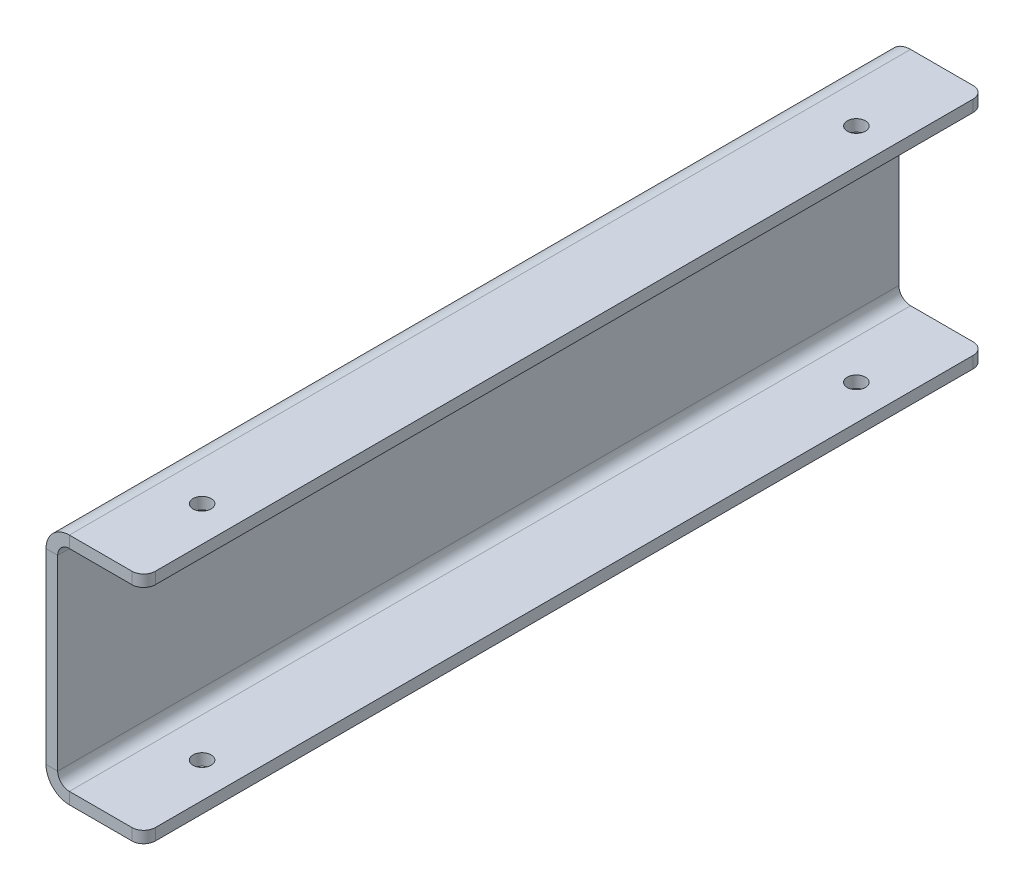
ISO-10303-21;
HEADER;
FILE_DESCRIPTION(('STEP AP214'),'2;1');
FILE_NAME('part.step','',(''),(''),'','','');
FILE_SCHEMA(('AUTOMOTIVE_DESIGN { 1 0 10303 214 1 1 1 1 }'));
ENDSEC;
DATA;
#1=APPLICATION_CONTEXT('core data for automotive mechanical design processes');
#2=APPLICATION_PROTOCOL_DEFINITION('international standard','automotive_design',2000,#1);
#3=PRODUCT_CONTEXT('',#1,'mechanical');
#4=PRODUCT('Part','Part','',(#3));
#5=PRODUCT_RELATED_PRODUCT_CATEGORY('part','',(#4));
#6=PRODUCT_DEFINITION_FORMATION('','',#4);
#7=PRODUCT_DEFINITION_CONTEXT('part definition',#1,'design');
#8=PRODUCT_DEFINITION('design','',#6,#7);
#9=PRODUCT_DEFINITION_SHAPE('','',#8);
#10=(LENGTH_UNIT() NAMED_UNIT(*) SI_UNIT(.MILLI.,.METRE.));
#11=(NAMED_UNIT(*) PLANE_ANGLE_UNIT() SI_UNIT($,.RADIAN.));
#12=(NAMED_UNIT(*) SI_UNIT($,.STERADIAN.) SOLID_ANGLE_UNIT());
#13=UNCERTAINTY_MEASURE_WITH_UNIT(LENGTH_MEASURE(1.E-05),#10,'distance_accuracy_value','');
#14=(GEOMETRIC_REPRESENTATION_CONTEXT(3) GLOBAL_UNCERTAINTY_ASSIGNED_CONTEXT((#13)) GLOBAL_UNIT_ASSIGNED_CONTEXT((#10,
#11,#12)) REPRESENTATION_CONTEXT('',''));
#15=CARTESIAN_POINT('',(0.,0.,0.));
#16=DIRECTION('',(0.,0.,1.));
#17=DIRECTION('',(1.,0.,0.));
#18=AXIS2_PLACEMENT_3D('',#15,#16,#17);
#19=CARTESIAN_POINT('',(-3.175,0.,0.));
#20=DIRECTION('',(-1.,0.,0.));
#21=DIRECTION('',(0.,0.,1.));
#22=AXIS2_PLACEMENT_3D('',#19,#20,#21);
#23=PLANE('',#22);
#24=DIRECTION('',(0.,1.,0.));
#25=VECTOR('',#24,1.);
#26=CARTESIAN_POINT('',(-3.175,0.,-228.6));
#27=LINE('',#26,#25);
#28=CARTESIAN_POINT('',(-3.17500000000002,6.35,-228.6));
#29=VERTEX_POINT('',#28);
#30=CARTESIAN_POINT('',(-3.175,57.15,-228.6));
#31=VERTEX_POINT('',#30);
#32=EDGE_CURVE('E350',#29,#31,#27,.T.);
#33=ORIENTED_EDGE('',*,*,#32,.F.);
#34=DIRECTION('',(0.,0.,-1.));
#35=VECTOR('',#34,1.);
#36=CARTESIAN_POINT('',(-3.17500000000002,6.35,-228.6));
#37=LINE('',#36,#35);
#38=CARTESIAN_POINT('',(-3.175,6.35000000000002,0.));
#39=VERTEX_POINT('',#38);
#40=EDGE_CURVE('E220',#29,#39,#37,.F.);
#41=ORIENTED_EDGE('',*,*,#40,.T.);
#42=DIRECTION('',(0.,-1.,0.));
#43=VECTOR('',#42,1.);
#44=CARTESIAN_POINT('',(-3.175,0.,0.));
#45=LINE('',#44,#43);
#46=CARTESIAN_POINT('',(-3.175,57.15,0.));
#47=VERTEX_POINT('',#46);
#48=EDGE_CURVE('E347',#47,#39,#45,.T.);
#49=ORIENTED_EDGE('',*,*,#48,.F.);
#50=DIRECTION('',(0.,0.,1.));
#51=VECTOR('',#50,1.);
#52=CARTESIAN_POINT('',(-3.175,57.15,0.));
#53=LINE('',#52,#51);
#54=EDGE_CURVE('E320',#47,#31,#53,.F.);
#55=ORIENTED_EDGE('',*,*,#54,.T.);
#56=EDGE_LOOP('',(#33,#41,#49,#55));
#57=FACE_BOUND('',#56,.T.);
#58=ADVANCED_FACE('F82',(#57),#23,.T.);
#59=CARTESIAN_POINT('',(0.,0.,0.));
#60=DIRECTION('',(-1.,0.,0.));
#61=DIRECTION('',(0.,0.,1.));
#62=AXIS2_PLACEMENT_3D('',#59,#60,#61);
#63=PLANE('',#62);
#64=DIRECTION('',(0.,0.,-1.));
#65=VECTOR('',#64,1.);
#66=CARTESIAN_POINT('',(0.,6.34999999999999,-228.6));
#67=LINE('',#66,#65);
#68=CARTESIAN_POINT('',(0.,6.34999999999999,-228.6));
#69=VERTEX_POINT('',#68);
#70=CARTESIAN_POINT('',(0.,6.35000000000002,0.));
#71=VERTEX_POINT('',#70);
#72=EDGE_CURVE('E275',#69,#71,#67,.F.);
#73=ORIENTED_EDGE('',*,*,#72,.F.);
#74=DIRECTION('',(0.,1.,0.));
#75=VECTOR('',#74,1.);
#76=CARTESIAN_POINT('',(0.,0.,-228.6));
#77=LINE('',#76,#75);
#78=CARTESIAN_POINT('',(0.,57.15,-228.6));
#79=VERTEX_POINT('',#78);
#80=EDGE_CURVE('E351',#69,#79,#77,.T.);
#81=ORIENTED_EDGE('',*,*,#80,.T.);
#82=DIRECTION('',(0.,0.,1.));
#83=VECTOR('',#82,1.);
#84=CARTESIAN_POINT('',(0.,57.15,0.));
#85=LINE('',#84,#83);
#86=CARTESIAN_POINT('',(0.,57.15,0.));
#87=VERTEX_POINT('',#86);
#88=EDGE_CURVE('E336',#87,#79,#85,.F.);
#89=ORIENTED_EDGE('',*,*,#88,.F.);
#90=DIRECTION('',(0.,-1.,0.));
#91=VECTOR('',#90,1.);
#92=CARTESIAN_POINT('',(0.,0.,0.));
#93=LINE('',#92,#91);
#94=EDGE_CURVE('E344',#87,#71,#93,.T.);
#95=ORIENTED_EDGE('',*,*,#94,.T.);
#96=EDGE_LOOP('',(#73,#81,#89,#95));
#97=FACE_BOUND('',#96,.T.);
#98=ADVANCED_FACE('F428',(#97),#63,.F.);
#99=CARTESIAN_POINT('',(-3.175,0.,-228.6));
#100=DIRECTION('',(0.,0.,-1.));
#101=DIRECTION('',(-1.,0.,0.));
#102=AXIS2_PLACEMENT_3D('',#99,#100,#101);
#103=PLANE('',#102);
#104=ORIENTED_EDGE('',*,*,#80,.F.);
#105=DIRECTION('',(-1.,0.,0.));
#106=VECTOR('',#105,1.);
#107=CARTESIAN_POINT('',(0.,6.34999999999999,-228.6));
#108=LINE('',#107,#106);
#109=EDGE_CURVE('E271',#69,#29,#108,.T.);
#110=ORIENTED_EDGE('',*,*,#109,.T.);
#111=ORIENTED_EDGE('',*,*,#32,.T.);
#112=DIRECTION('',(-1.,0.,0.));
#113=VECTOR('',#112,1.);
#114=CARTESIAN_POINT('',(0.,57.15,-228.6));
#115=LINE('',#114,#113);
#116=EDGE_CURVE('E341',#79,#31,#115,.T.);
#117=ORIENTED_EDGE('',*,*,#116,.F.);
#118=EDGE_LOOP('',(#104,#110,#111,#117));
#119=FACE_BOUND('',#118,.T.);
#120=ADVANCED_FACE('F490',(#119),#103,.T.);
#121=CARTESIAN_POINT('',(-3.175,0.,0.));
#122=DIRECTION('',(0.,0.,1.));
#123=DIRECTION('',(1.,0.,0.));
#124=AXIS2_PLACEMENT_3D('',#121,#122,#123);
#125=PLANE('',#124);
#126=DIRECTION('',(-1.,0.,0.));
#127=VECTOR('',#126,1.);
#128=CARTESIAN_POINT('',(0.,6.35000000000002,0.));
#129=LINE('',#128,#127);
#130=EDGE_CURVE('E280',#71,#39,#129,.T.);
#131=ORIENTED_EDGE('',*,*,#130,.F.);
#132=ORIENTED_EDGE('',*,*,#94,.F.);
#133=DIRECTION('',(-1.,0.,0.));
#134=VECTOR('',#133,1.);
#135=CARTESIAN_POINT('',(0.,57.15,0.));
#136=LINE('',#135,#134);
#137=EDGE_CURVE('E329',#87,#47,#136,.T.);
#138=ORIENTED_EDGE('',*,*,#137,.T.);
#139=ORIENTED_EDGE('',*,*,#48,.T.);
#140=EDGE_LOOP('',(#131,#132,#138,#139));
#141=FACE_BOUND('',#140,.T.);
#142=ADVANCED_FACE('F424',(#141),#125,.T.);
#143=CARTESIAN_POINT('',(3.175,57.15,-228.6));
#144=DIRECTION('',(0.,0.,-1.));
#145=DIRECTION('',(-1.,0.,0.));
#146=AXIS2_PLACEMENT_3D('',#143,#144,#145);
#147=PLANE('',#146);
#148=DIRECTION('',(0.,-1.,0.));
#149=VECTOR('',#148,1.);
#150=CARTESIAN_POINT('',(3.17499999999998,63.5,-228.6));
#151=LINE('',#150,#149);
#152=CARTESIAN_POINT('',(3.17499999999999,60.325,-228.6));
#153=VERTEX_POINT('',#152);
#154=CARTESIAN_POINT('',(3.17499999999998,63.5,-228.6));
#155=VERTEX_POINT('',#154);
#156=EDGE_CURVE('E283',#153,#155,#151,.F.);
#157=ORIENTED_EDGE('',*,*,#156,.F.);
#158=CARTESIAN_POINT('',(3.175,57.15,-228.6));
#159=DIRECTION('',(0.,0.,1.));
#160=DIRECTION('',(1.,0.,0.));
#161=AXIS2_PLACEMENT_3D('',#158,#159,#160);
#162=CIRCLE('',#161,3.175);
#163=EDGE_CURVE('E332',#79,#153,#162,.F.);
#164=ORIENTED_EDGE('',*,*,#163,.F.);
#165=ORIENTED_EDGE('',*,*,#116,.T.);
#166=CARTESIAN_POINT('',(3.175,57.15,-228.6));
#167=DIRECTION('',(0.,0.,1.));
#168=DIRECTION('',(1.,0.,0.));
#169=AXIS2_PLACEMENT_3D('',#166,#167,#168);
#170=CIRCLE('',#169,6.35);
#171=EDGE_CURVE('E324',#31,#155,#170,.F.);
#172=ORIENTED_EDGE('',*,*,#171,.T.);
#173=EDGE_LOOP('',(#157,#164,#165,#172));
#174=FACE_BOUND('',#173,.T.);
#175=ADVANCED_FACE('F438',(#174),#147,.T.);
#176=CARTESIAN_POINT('',(3.175,57.15,0.));
#177=DIRECTION('',(0.,0.,-1.));
#178=DIRECTION('',(-1.,0.,0.));
#179=AXIS2_PLACEMENT_3D('',#176,#177,#178);
#180=PLANE('',#179);
#181=CARTESIAN_POINT('',(3.175,57.15,0.));
#182=DIRECTION('',(0.,0.,1.));
#183=DIRECTION('',(1.,0.,0.));
#184=AXIS2_PLACEMENT_3D('',#181,#182,#183);
#185=CIRCLE('',#184,3.175);
#186=CARTESIAN_POINT('',(3.17499999999999,60.325,0.));
#187=VERTEX_POINT('',#186);
#188=EDGE_CURVE('E289',#187,#87,#185,.T.);
#189=ORIENTED_EDGE('',*,*,#188,.F.);
#190=DIRECTION('',(0.,-1.,0.));
#191=VECTOR('',#190,1.);
#192=CARTESIAN_POINT('',(3.17499999999999,60.325,0.));
#193=LINE('',#192,#191);
#194=CARTESIAN_POINT('',(3.17499999999998,63.5,0.));
#195=VERTEX_POINT('',#194);
#196=EDGE_CURVE('E311',#187,#195,#193,.F.);
#197=ORIENTED_EDGE('',*,*,#196,.T.);
#198=CARTESIAN_POINT('',(3.175,57.15,0.));
#199=DIRECTION('',(0.,0.,1.));
#200=DIRECTION('',(1.,0.,0.));
#201=AXIS2_PLACEMENT_3D('',#198,#199,#200);
#202=CIRCLE('',#201,6.35);
#203=EDGE_CURVE('E325',#195,#47,#202,.T.);
#204=ORIENTED_EDGE('',*,*,#203,.T.);
#205=ORIENTED_EDGE('',*,*,#137,.F.);
#206=EDGE_LOOP('',(#189,#197,#204,#205));
#207=FACE_BOUND('',#206,.T.);
#208=ADVANCED_FACE('F450',(#207),#180,.F.);
#209=CARTESIAN_POINT('',(3.175,57.15,0.));
#210=DIRECTION('',(0.,0.,1.));
#211=DIRECTION('',(0.,1.,0.));
#212=AXIS2_PLACEMENT_3D('',#209,#210,#211);
#213=CYLINDRICAL_SURFACE('',#212,6.35);
#214=ORIENTED_EDGE('',*,*,#54,.F.);
#215=ORIENTED_EDGE('',*,*,#203,.F.);
#216=DIRECTION('',(0.,0.,1.));
#217=VECTOR('',#216,1.);
#218=CARTESIAN_POINT('',(3.17499999999998,63.5,-228.6));
#219=LINE('',#218,#217);
#220=EDGE_CURVE('E307',#195,#155,#219,.F.);
#221=ORIENTED_EDGE('',*,*,#220,.T.);
#222=ORIENTED_EDGE('',*,*,#171,.F.);
#223=EDGE_LOOP('',(#214,#215,#221,#222));
#224=FACE_BOUND('',#223,.T.);
#225=ADVANCED_FACE('F505',(#224),#213,.T.);
#226=CARTESIAN_POINT('',(3.175,57.15,0.));
#227=DIRECTION('',(0.,0.,1.));
#228=DIRECTION('',(0.,1.,0.));
#229=AXIS2_PLACEMENT_3D('',#226,#227,#228);
#230=CYLINDRICAL_SURFACE('',#229,3.175);
#231=ORIENTED_EDGE('',*,*,#88,.T.);
#232=ORIENTED_EDGE('',*,*,#163,.T.);
#233=DIRECTION('',(0.,0.,1.));
#234=VECTOR('',#233,1.);
#235=CARTESIAN_POINT('',(3.17499999999999,60.325,-228.6));
#236=LINE('',#235,#234);
#237=EDGE_CURVE('E314',#153,#187,#236,.T.);
#238=ORIENTED_EDGE('',*,*,#237,.T.);
#239=ORIENTED_EDGE('',*,*,#188,.T.);
#240=EDGE_LOOP('',(#231,#232,#238,#239));
#241=FACE_BOUND('',#240,.T.);
#242=ADVANCED_FACE('F433',(#241),#230,.F.);
#243=CARTESIAN_POINT('',(23.368,63.5000000000001,0.));
#244=DIRECTION('',(0.,0.,-1.));
#245=DIRECTION('',(-1.,0.,0.));
#246=AXIS2_PLACEMENT_3D('',#243,#244,#245);
#247=PLANE('',#246);
#248=DIRECTION('',(-1.,0.,0.));
#249=VECTOR('',#248,1.);
#250=CARTESIAN_POINT('',(23.368,60.3250000000001,0.));
#251=LINE('',#250,#249);
#252=CARTESIAN_POINT('',(20.193,60.3250000000001,0.));
#253=VERTEX_POINT('',#252);
#254=EDGE_CURVE('E304',#187,#253,#251,.F.);
#255=ORIENTED_EDGE('',*,*,#254,.T.);
#256=DIRECTION('',(0.,-1.,0.));
#257=VECTOR('',#256,1.);
#258=CARTESIAN_POINT('',(20.193,63.5000000000001,0.));
#259=LINE('',#258,#257);
#260=CARTESIAN_POINT('',(20.193,63.5000000000001,0.));
#261=VERTEX_POINT('',#260);
#262=EDGE_CURVE('E13',#253,#261,#259,.F.);
#263=ORIENTED_EDGE('',*,*,#262,.T.);
#264=DIRECTION('',(1.,0.,0.));
#265=VECTOR('',#264,1.);
#266=CARTESIAN_POINT('',(-2.37353732726063E-13,63.5,0.));
#267=LINE('',#266,#265);
#268=EDGE_CURVE('E294',#195,#261,#267,.T.);
#269=ORIENTED_EDGE('',*,*,#268,.F.);
#270=ORIENTED_EDGE('',*,*,#196,.F.);
#271=EDGE_LOOP('',(#255,#263,#269,#270));
#272=FACE_BOUND('',#271,.T.);
#273=ADVANCED_FACE('F454',(#272),#247,.F.);
#274=CARTESIAN_POINT('',(0.,63.5,-228.6));
#275=DIRECTION('',(0.,0.,1.));
#276=DIRECTION('',(1.,0.,0.));
#277=AXIS2_PLACEMENT_3D('',#274,#275,#276);
#278=PLANE('',#277);
#279=DIRECTION('',(-1.,0.,0.));
#280=VECTOR('',#279,1.);
#281=CARTESIAN_POINT('',(-2.37353732726063E-13,63.5,-228.6));
#282=LINE('',#281,#280);
#283=CARTESIAN_POINT('',(20.193,63.5000000000001,-228.6));
#284=VERTEX_POINT('',#283);
#285=EDGE_CURVE('E286',#284,#155,#282,.T.);
#286=ORIENTED_EDGE('',*,*,#285,.F.);
#287=DIRECTION('',(0.,-1.,0.));
#288=VECTOR('',#287,1.);
#289=CARTESIAN_POINT('',(20.193,63.5000000000001,-228.6));
#290=LINE('',#289,#288);
#291=CARTESIAN_POINT('',(20.193,60.3250000000001,-228.6));
#292=VERTEX_POINT('',#291);
#293=EDGE_CURVE('E355',#284,#292,#290,.T.);
#294=ORIENTED_EDGE('',*,*,#293,.T.);
#295=DIRECTION('',(1.,0.,0.));
#296=VECTOR('',#295,1.);
#297=CARTESIAN_POINT('',(0.,60.325,-228.6));
#298=LINE('',#297,#296);
#299=EDGE_CURVE('E297',#292,#153,#298,.F.);
#300=ORIENTED_EDGE('',*,*,#299,.T.);
#301=ORIENTED_EDGE('',*,*,#156,.T.);
#302=EDGE_LOOP('',(#286,#294,#300,#301));
#303=FACE_BOUND('',#302,.T.);
#304=ADVANCED_FACE('F441',(#303),#278,.F.);
#305=CARTESIAN_POINT('',(-2.37353732726063E-13,63.5,0.));
#306=DIRECTION('',(0.,-1.,0.));
#307=DIRECTION('',(1.,0.,0.));
#308=AXIS2_PLACEMENT_3D('',#305,#306,#307);
#309=PLANE('',#308);
#310=CARTESIAN_POINT('',(13.843,63.5000000000001,-203.2));
#311=DIRECTION('',(0.,1.,0.));
#312=DIRECTION('',(-1.,0.,0.));
#313=AXIS2_PLACEMENT_3D('',#310,#311,#312);
#314=CIRCLE('',#313,2.45745);
#315=CARTESIAN_POINT('',(11.38555,63.5,-203.2));
#316=VERTEX_POINT('',#315);
#317=EDGE_CURVE('E560',#316,#316,#314,.T.);
#318=ORIENTED_EDGE('',*,*,#317,.F.);
#319=EDGE_LOOP('',(#318));
#320=FACE_BOUND('',#319,.T.);
#321=CARTESIAN_POINT('',(13.843,63.5000000000001,-25.4));
#322=DIRECTION('',(0.,1.,0.));
#323=DIRECTION('',(-1.,0.,0.));
#324=AXIS2_PLACEMENT_3D('',#321,#322,#323);
#325=CIRCLE('',#324,2.45745);
#326=CARTESIAN_POINT('',(11.38555,63.5,-25.4));
#327=VERTEX_POINT('',#326);
#328=EDGE_CURVE('E569',#327,#327,#325,.T.);
#329=ORIENTED_EDGE('',*,*,#328,.F.);
#330=EDGE_LOOP('',(#329));
#331=FACE_BOUND('',#330,.T.);
#332=DIRECTION('',(0.,0.,-1.));
#333=VECTOR('',#332,1.);
#334=CARTESIAN_POINT('',(23.368,63.5000000000001,0.));
#335=LINE('',#334,#333);
#336=CARTESIAN_POINT('',(23.368,63.5000000000001,-3.17500000000001));
#337=VERTEX_POINT('',#336);
#338=CARTESIAN_POINT('',(23.368,63.5000000000001,-225.425));
#339=VERTEX_POINT('',#338);
#340=EDGE_CURVE('E290',#337,#339,#335,.T.);
#341=ORIENTED_EDGE('',*,*,#340,.T.);
#342=CARTESIAN_POINT('',(20.193,63.5000000000001,-225.425));
#343=DIRECTION('',(0.,-1.,0.));
#344=DIRECTION('',(1.,0.,0.));
#345=AXIS2_PLACEMENT_3D('',#342,#343,#344);
#346=CIRCLE('',#345,3.175);
#347=EDGE_CURVE('E385',#339,#284,#346,.F.);
#348=ORIENTED_EDGE('',*,*,#347,.T.);
#349=ORIENTED_EDGE('',*,*,#285,.T.);
#350=ORIENTED_EDGE('',*,*,#220,.F.);
#351=ORIENTED_EDGE('',*,*,#268,.T.);
#352=CARTESIAN_POINT('',(20.193,63.5000000000001,-3.17500000000001));
#353=DIRECTION('',(0.,-1.,0.));
#354=DIRECTION('',(1.,0.,0.));
#355=AXIS2_PLACEMENT_3D('',#352,#353,#354);
#356=CIRCLE('',#355,3.175);
#357=EDGE_CURVE('E383',#261,#337,#356,.F.);
#358=ORIENTED_EDGE('',*,*,#357,.T.);
#359=EDGE_LOOP('',(#341,#348,#349,#350,#351,#358));
#360=FACE_BOUND('',#359,.T.);
#361=ADVANCED_FACE('F458',(#320,#331,#360),#309,.F.);
#362=CARTESIAN_POINT('',(-2.26268279475236E-13,60.325,0.));
#363=DIRECTION('',(0.,-1.,0.));
#364=DIRECTION('',(1.,0.,0.));
#365=AXIS2_PLACEMENT_3D('',#362,#363,#364);
#366=PLANE('',#365);
#367=CARTESIAN_POINT('',(13.843,60.3250000000001,-203.2));
#368=DIRECTION('',(0.,-1.,0.));
#369=DIRECTION('',(1.,0.,0.));
#370=AXIS2_PLACEMENT_3D('',#367,#368,#369);
#371=CIRCLE('',#370,2.45745);
#372=CARTESIAN_POINT('',(16.30045,60.3250000000001,-203.2));
#373=VERTEX_POINT('',#372);
#374=EDGE_CURVE('E267',#373,#373,#371,.T.);
#375=ORIENTED_EDGE('',*,*,#374,.F.);
#376=EDGE_LOOP('',(#375));
#377=FACE_BOUND('',#376,.T.);
#378=CARTESIAN_POINT('',(13.843,60.3250000000001,-25.4));
#379=DIRECTION('',(0.,-1.,0.));
#380=DIRECTION('',(1.,0.,0.));
#381=AXIS2_PLACEMENT_3D('',#378,#379,#380);
#382=CIRCLE('',#381,2.45745);
#383=CARTESIAN_POINT('',(16.30045,60.3250000000001,-25.4));
#384=VERTEX_POINT('',#383);
#385=EDGE_CURVE('E363',#384,#384,#382,.T.);
#386=ORIENTED_EDGE('',*,*,#385,.F.);
#387=EDGE_LOOP('',(#386));
#388=FACE_BOUND('',#387,.T.);
#389=ORIENTED_EDGE('',*,*,#299,.F.);
#390=CARTESIAN_POINT('',(20.193,60.3250000000001,-225.425));
#391=DIRECTION('',(0.,-1.,0.));
#392=DIRECTION('',(1.,0.,0.));
#393=AXIS2_PLACEMENT_3D('',#390,#391,#392);
#394=CIRCLE('',#393,3.175);
#395=CARTESIAN_POINT('',(23.368,60.3250000000001,-225.425));
#396=VERTEX_POINT('',#395);
#397=EDGE_CURVE('E374',#292,#396,#394,.T.);
#398=ORIENTED_EDGE('',*,*,#397,.T.);
#399=DIRECTION('',(0.,0.,1.));
#400=VECTOR('',#399,1.);
#401=CARTESIAN_POINT('',(23.368,60.3250000000001,-228.6));
#402=LINE('',#401,#400);
#403=CARTESIAN_POINT('',(23.368,60.3250000000001,-3.17500000000001));
#404=VERTEX_POINT('',#403);
#405=EDGE_CURVE('E300',#404,#396,#402,.F.);
#406=ORIENTED_EDGE('',*,*,#405,.F.);
#407=CARTESIAN_POINT('',(20.193,60.3250000000001,-3.17500000000001));
#408=DIRECTION('',(0.,-1.,0.));
#409=DIRECTION('',(1.,0.,0.));
#410=AXIS2_PLACEMENT_3D('',#407,#408,#409);
#411=CIRCLE('',#410,3.175);
#412=EDGE_CURVE('E372',#404,#253,#411,.T.);
#413=ORIENTED_EDGE('',*,*,#412,.T.);
#414=ORIENTED_EDGE('',*,*,#254,.F.);
#415=ORIENTED_EDGE('',*,*,#237,.F.);
#416=EDGE_LOOP('',(#389,#398,#406,#413,#414,#415));
#417=FACE_BOUND('',#416,.T.);
#418=ADVANCED_FACE('F445',(#377,#388,#417),#366,.T.);
#419=CARTESIAN_POINT('',(23.368,63.5000000000001,-228.6));
#420=DIRECTION('',(-1.,0.,0.));
#421=DIRECTION('',(0.,-1.,0.));
#422=AXIS2_PLACEMENT_3D('',#419,#420,#421);
#423=PLANE('',#422);
#424=ORIENTED_EDGE('',*,*,#405,.T.);
#425=DIRECTION('',(0.,-1.,0.));
#426=VECTOR('',#425,1.);
#427=CARTESIAN_POINT('',(23.368,63.5000000000001,-225.425));
#428=LINE('',#427,#426);
#429=EDGE_CURVE('E380',#396,#339,#428,.F.);
#430=ORIENTED_EDGE('',*,*,#429,.T.);
#431=ORIENTED_EDGE('',*,*,#340,.F.);
#432=DIRECTION('',(0.,-1.,0.));
#433=VECTOR('',#432,1.);
#434=CARTESIAN_POINT('',(23.368,63.5000000000001,-3.17500000000001));
#435=LINE('',#434,#433);
#436=EDGE_CURVE('E377',#337,#404,#435,.T.);
#437=ORIENTED_EDGE('',*,*,#436,.T.);
#438=EDGE_LOOP('',(#424,#430,#431,#437));
#439=FACE_BOUND('',#438,.T.);
#440=ADVANCED_FACE('F463',(#439),#423,.F.);
#441=CARTESIAN_POINT('',(3.175,6.35,0.));
#442=DIRECTION('',(0.,0.,1.));
#443=DIRECTION('',(0.,-1.,0.));
#444=AXIS2_PLACEMENT_3D('',#441,#442,#443);
#445=PLANE('',#444);
#446=DIRECTION('',(0.,1.,0.));
#447=VECTOR('',#446,1.);
#448=CARTESIAN_POINT('',(3.17499999999998,0.,0.));
#449=LINE('',#448,#447);
#450=CARTESIAN_POINT('',(3.17499999999999,3.17499999999999,0.));
#451=VERTEX_POINT('',#450);
#452=CARTESIAN_POINT('',(3.17499999999998,0.,0.));
#453=VERTEX_POINT('',#452);
#454=EDGE_CURVE('E264',#451,#453,#449,.F.);
#455=ORIENTED_EDGE('',*,*,#454,.F.);
#456=CARTESIAN_POINT('',(3.175,6.35,0.));
#457=DIRECTION('',(0.,0.,-1.));
#458=DIRECTION('',(0.,1.,0.));
#459=AXIS2_PLACEMENT_3D('',#456,#457,#458);
#460=CIRCLE('',#459,3.17500000000002);
#461=EDGE_CURVE('E224',#71,#451,#460,.F.);
#462=ORIENTED_EDGE('',*,*,#461,.F.);
#463=ORIENTED_EDGE('',*,*,#130,.T.);
#464=CARTESIAN_POINT('',(3.175,6.35,0.));
#465=DIRECTION('',(0.,0.,-1.));
#466=DIRECTION('',(0.,1.,0.));
#467=AXIS2_PLACEMENT_3D('',#464,#465,#466);
#468=CIRCLE('',#467,6.35000000000002);
#469=EDGE_CURVE('E270',#39,#453,#468,.F.);
#470=ORIENTED_EDGE('',*,*,#469,.T.);
#471=EDGE_LOOP('',(#455,#462,#463,#470));
#472=FACE_BOUND('',#471,.T.);
#473=ADVANCED_FACE('F421',(#472),#445,.T.);
#474=CARTESIAN_POINT('',(3.175,6.34999999999997,-228.6));
#475=DIRECTION('',(0.,0.,1.));
#476=DIRECTION('',(0.,-1.,0.));
#477=AXIS2_PLACEMENT_3D('',#474,#475,#476);
#478=PLANE('',#477);
#479=CARTESIAN_POINT('',(3.175,6.34999999999997,-228.6));
#480=DIRECTION('',(0.,0.,-1.));
#481=DIRECTION('',(0.,1.,0.));
#482=AXIS2_PLACEMENT_3D('',#479,#480,#481);
#483=CIRCLE('',#482,3.17500000000002);
#484=CARTESIAN_POINT('',(3.17499999999999,3.17499999999996,-228.6));
#485=VERTEX_POINT('',#484);
#486=EDGE_CURVE('E231',#485,#69,#483,.T.);
#487=ORIENTED_EDGE('',*,*,#486,.F.);
#488=DIRECTION('',(0.,1.,0.));
#489=VECTOR('',#488,1.);
#490=CARTESIAN_POINT('',(3.17499999999999,3.17499999999999,-228.6));
#491=LINE('',#490,#489);
#492=CARTESIAN_POINT('',(3.17499999999998,0.,-228.6));
#493=VERTEX_POINT('',#492);
#494=EDGE_CURVE('E228',#485,#493,#491,.F.);
#495=ORIENTED_EDGE('',*,*,#494,.T.);
#496=CARTESIAN_POINT('',(3.175,6.34999999999997,-228.6));
#497=DIRECTION('',(0.,0.,-1.));
#498=DIRECTION('',(0.,1.,0.));
#499=AXIS2_PLACEMENT_3D('',#496,#497,#498);
#500=CIRCLE('',#499,6.35000000000002);
#501=EDGE_CURVE('E213',#493,#29,#500,.T.);
#502=ORIENTED_EDGE('',*,*,#501,.T.);
#503=ORIENTED_EDGE('',*,*,#109,.F.);
#504=EDGE_LOOP('',(#487,#495,#502,#503));
#505=FACE_BOUND('',#504,.T.);
#506=ADVANCED_FACE('F229',(#505),#478,.F.);
#507=CARTESIAN_POINT('',(3.175,6.34999999999997,-228.6));
#508=DIRECTION('',(0.,0.,-1.));
#509=DIRECTION('',(0.,-1.,0.));
#510=AXIS2_PLACEMENT_3D('',#507,#508,#509);
#511=CYLINDRICAL_SURFACE('',#510,6.35000000000002);
#512=ORIENTED_EDGE('',*,*,#40,.F.);
#513=ORIENTED_EDGE('',*,*,#501,.F.);
#514=DIRECTION('',(0.,0.,-1.));
#515=VECTOR('',#514,1.);
#516=CARTESIAN_POINT('',(3.17499999999998,0.,0.));
#517=LINE('',#516,#515);
#518=EDGE_CURVE('E217',#493,#453,#517,.F.);
#519=ORIENTED_EDGE('',*,*,#518,.T.);
#520=ORIENTED_EDGE('',*,*,#469,.F.);
#521=EDGE_LOOP('',(#512,#513,#519,#520));
#522=FACE_BOUND('',#521,.T.);
#523=ADVANCED_FACE('F215',(#522),#511,.T.);
#524=CARTESIAN_POINT('',(3.175,6.34999999999997,-228.6));
#525=DIRECTION('',(0.,0.,-1.));
#526=DIRECTION('',(0.,-1.,0.));
#527=AXIS2_PLACEMENT_3D('',#524,#525,#526);
#528=CYLINDRICAL_SURFACE('',#527,3.17500000000002);
#529=ORIENTED_EDGE('',*,*,#72,.T.);
#530=ORIENTED_EDGE('',*,*,#461,.T.);
#531=DIRECTION('',(0.,0.,-1.));
#532=VECTOR('',#531,1.);
#533=CARTESIAN_POINT('',(3.17499999999999,3.17499999999999,0.));
#534=LINE('',#533,#532);
#535=EDGE_CURVE('E234',#451,#485,#534,.T.);
#536=ORIENTED_EDGE('',*,*,#535,.T.);
#537=ORIENTED_EDGE('',*,*,#486,.T.);
#538=EDGE_LOOP('',(#529,#530,#536,#537));
#539=FACE_BOUND('',#538,.T.);
#540=ADVANCED_FACE('F416',(#539),#528,.F.);
#541=CARTESIAN_POINT('',(0.,0.,0.));
#542=DIRECTION('',(0.,0.,-1.));
#543=DIRECTION('',(-1.,0.,0.));
#544=AXIS2_PLACEMENT_3D('',#541,#542,#543);
#545=PLANE('',#544);
#546=DIRECTION('',(-1.,0.,0.));
#547=VECTOR('',#546,1.);
#548=CARTESIAN_POINT('',(0.,0.,0.));
#549=LINE('',#548,#547);
#550=CARTESIAN_POINT('',(20.193,0.,0.));
#551=VERTEX_POINT('',#550);
#552=EDGE_CURVE('E239',#551,#453,#549,.T.);
#553=ORIENTED_EDGE('',*,*,#552,.F.);
#554=DIRECTION('',(0.,1.,0.));
#555=VECTOR('',#554,1.);
#556=CARTESIAN_POINT('',(20.193,0.,0.));
#557=LINE('',#556,#555);
#558=CARTESIAN_POINT('',(20.193,3.17499999999993,0.));
#559=VERTEX_POINT('',#558);
#560=EDGE_CURVE('E90',#551,#559,#557,.T.);
#561=ORIENTED_EDGE('',*,*,#560,.T.);
#562=DIRECTION('',(1.,0.,0.));
#563=VECTOR('',#562,1.);
#564=CARTESIAN_POINT('',(0.,3.175,0.));
#565=LINE('',#564,#563);
#566=EDGE_CURVE('E241',#559,#451,#565,.F.);
#567=ORIENTED_EDGE('',*,*,#566,.T.);
#568=ORIENTED_EDGE('',*,*,#454,.T.);
#569=EDGE_LOOP('',(#553,#561,#567,#568));
#570=FACE_BOUND('',#569,.T.);
#571=ADVANCED_FACE('F408',(#570),#545,.F.);
#572=CARTESIAN_POINT('',(23.368,0.,-228.6));
#573=DIRECTION('',(0.,0.,1.));
#574=DIRECTION('',(1.,0.,0.));
#575=AXIS2_PLACEMENT_3D('',#572,#573,#574);
#576=PLANE('',#575);
#577=DIRECTION('',(-1.,0.,0.));
#578=VECTOR('',#577,1.);
#579=CARTESIAN_POINT('',(23.368,3.17499999999992,-228.6));
#580=LINE('',#579,#578);
#581=CARTESIAN_POINT('',(20.193,3.17499999999993,-228.6));
#582=VERTEX_POINT('',#581);
#583=EDGE_CURVE('E258',#485,#582,#580,.F.);
#584=ORIENTED_EDGE('',*,*,#583,.T.);
#585=DIRECTION('',(0.,1.,0.));
#586=VECTOR('',#585,1.);
#587=CARTESIAN_POINT('',(20.193,0.,-228.6));
#588=LINE('',#587,#586);
#589=CARTESIAN_POINT('',(20.193,0.,-228.6));
#590=VERTEX_POINT('',#589);
#591=EDGE_CURVE('E108',#582,#590,#588,.F.);
#592=ORIENTED_EDGE('',*,*,#591,.T.);
#593=DIRECTION('',(1.,0.,0.));
#594=VECTOR('',#593,1.);
#595=CARTESIAN_POINT('',(0.,0.,-228.6));
#596=LINE('',#595,#594);
#597=EDGE_CURVE('E237',#493,#590,#596,.T.);
#598=ORIENTED_EDGE('',*,*,#597,.F.);
#599=ORIENTED_EDGE('',*,*,#494,.F.);
#600=EDGE_LOOP('',(#584,#592,#598,#599));
#601=FACE_BOUND('',#600,.T.);
#602=ADVANCED_FACE('F243',(#601),#576,.F.);
#603=CARTESIAN_POINT('',(0.,0.,0.));
#604=DIRECTION('',(0.,1.,0.));
#605=DIRECTION('',(-1.,0.,0.));
#606=AXIS2_PLACEMENT_3D('',#603,#604,#605);
#607=PLANE('',#606);
#608=CARTESIAN_POINT('',(13.8430000000002,-1.11022302462516E-13,-203.2));
#609=DIRECTION('',(0.,1.,0.));
#610=DIRECTION('',(-1.,0.,0.));
#611=AXIS2_PLACEMENT_3D('',#608,#609,#610);
#612=CIRCLE('',#611,2.45745);
#613=CARTESIAN_POINT('',(11.3855500000002,-1.20229223402443E-13,-203.2));
#614=VERTEX_POINT('',#613);
#615=EDGE_CURVE('E364',#614,#614,#612,.T.);
#616=ORIENTED_EDGE('',*,*,#615,.T.);
#617=EDGE_LOOP('',(#616));
#618=FACE_BOUND('',#617,.T.);
#619=CARTESIAN_POINT('',(13.8430000000002,-1.11022302462516E-13,-25.4));
#620=DIRECTION('',(0.,1.,0.));
#621=DIRECTION('',(-1.,0.,0.));
#622=AXIS2_PLACEMENT_3D('',#619,#620,#621);
#623=CIRCLE('',#622,2.45745);
#624=CARTESIAN_POINT('',(11.3855500000002,-1.20229223402443E-13,-25.4));
#625=VERTEX_POINT('',#624);
#626=EDGE_CURVE('E564',#625,#625,#623,.T.);
#627=ORIENTED_EDGE('',*,*,#626,.T.);
#628=EDGE_LOOP('',(#627));
#629=FACE_BOUND('',#628,.T.);
#630=ORIENTED_EDGE('',*,*,#597,.T.);
#631=CARTESIAN_POINT('',(20.193,0.,-225.425));
#632=DIRECTION('',(0.,1.,0.));
#633=DIRECTION('',(-1.,0.,0.));
#634=AXIS2_PLACEMENT_3D('',#631,#632,#633);
#635=CIRCLE('',#634,3.175);
#636=CARTESIAN_POINT('',(23.368,0.,-225.425));
#637=VERTEX_POINT('',#636);
#638=EDGE_CURVE('E402',#590,#637,#635,.F.);
#639=ORIENTED_EDGE('',*,*,#638,.T.);
#640=DIRECTION('',(0.,0.,1.));
#641=VECTOR('',#640,1.);
#642=CARTESIAN_POINT('',(23.368,0.,0.));
#643=LINE('',#642,#641);
#644=CARTESIAN_POINT('',(23.368,0.,-3.175));
#645=VERTEX_POINT('',#644);
#646=EDGE_CURVE('E245',#637,#645,#643,.T.);
#647=ORIENTED_EDGE('',*,*,#646,.T.);
#648=CARTESIAN_POINT('',(20.193,0.,-3.175));
#649=DIRECTION('',(0.,1.,0.));
#650=DIRECTION('',(-1.,0.,0.));
#651=AXIS2_PLACEMENT_3D('',#648,#649,#650);
#652=CIRCLE('',#651,3.175);
#653=EDGE_CURVE('E97',#645,#551,#652,.F.);
#654=ORIENTED_EDGE('',*,*,#653,.T.);
#655=ORIENTED_EDGE('',*,*,#552,.T.);
#656=ORIENTED_EDGE('',*,*,#518,.F.);
#657=EDGE_LOOP('',(#630,#639,#647,#654,#655,#656));
#658=FACE_BOUND('',#657,.T.);
#659=ADVANCED_FACE('F236',(#618,#629,#658),#607,.F.);
#660=CARTESIAN_POINT('',(0.,3.175,0.));
#661=DIRECTION('',(0.,1.,0.));
#662=DIRECTION('',(-1.,0.,0.));
#663=AXIS2_PLACEMENT_3D('',#660,#661,#662);
#664=PLANE('',#663);
#665=CARTESIAN_POINT('',(13.8430000000002,3.17499999999995,-203.2));
#666=DIRECTION('',(0.,1.,0.));
#667=DIRECTION('',(-1.,0.,0.));
#668=AXIS2_PLACEMENT_3D('',#665,#666,#667);
#669=CIRCLE('',#668,2.45745);
#670=CARTESIAN_POINT('',(11.3855500000002,3.17499999999996,-203.2));
#671=VERTEX_POINT('',#670);
#672=EDGE_CURVE('E365',#671,#671,#669,.T.);
#673=ORIENTED_EDGE('',*,*,#672,.F.);
#674=EDGE_LOOP('',(#673));
#675=FACE_BOUND('',#674,.T.);
#676=CARTESIAN_POINT('',(13.8430000000002,3.17499999999995,-25.4));
#677=DIRECTION('',(0.,1.,0.));
#678=DIRECTION('',(-1.,0.,0.));
#679=AXIS2_PLACEMENT_3D('',#676,#677,#678);
#680=CIRCLE('',#679,2.45745);
#681=CARTESIAN_POINT('',(11.3855500000002,3.17499999999996,-25.4));
#682=VERTEX_POINT('',#681);
#683=EDGE_CURVE('E360',#682,#682,#680,.T.);
#684=ORIENTED_EDGE('',*,*,#683,.F.);
#685=EDGE_LOOP('',(#684));
#686=FACE_BOUND('',#685,.T.);
#687=DIRECTION('',(0.,0.,-1.));
#688=VECTOR('',#687,1.);
#689=CARTESIAN_POINT('',(23.368,3.17499999999992,0.));
#690=LINE('',#689,#688);
#691=CARTESIAN_POINT('',(23.368,3.17499999999992,-225.425));
#692=VERTEX_POINT('',#691);
#693=CARTESIAN_POINT('',(23.368,3.17499999999992,-3.175));
#694=VERTEX_POINT('',#693);
#695=EDGE_CURVE('E251',#692,#694,#690,.F.);
#696=ORIENTED_EDGE('',*,*,#695,.F.);
#697=CARTESIAN_POINT('',(20.193,3.17499999999993,-225.425));
#698=DIRECTION('',(0.,1.,0.));
#699=DIRECTION('',(-1.,0.,0.));
#700=AXIS2_PLACEMENT_3D('',#697,#698,#699);
#701=CIRCLE('',#700,3.175);
#702=EDGE_CURVE('E396',#692,#582,#701,.T.);
#703=ORIENTED_EDGE('',*,*,#702,.T.);
#704=ORIENTED_EDGE('',*,*,#583,.F.);
#705=ORIENTED_EDGE('',*,*,#535,.F.);
#706=ORIENTED_EDGE('',*,*,#566,.F.);
#707=CARTESIAN_POINT('',(20.193,3.17499999999993,-3.175));
#708=DIRECTION('',(0.,1.,0.));
#709=DIRECTION('',(-1.,0.,0.));
#710=AXIS2_PLACEMENT_3D('',#707,#708,#709);
#711=CIRCLE('',#710,3.175);
#712=EDGE_CURVE('E394',#559,#694,#711,.T.);
#713=ORIENTED_EDGE('',*,*,#712,.T.);
#714=EDGE_LOOP('',(#696,#703,#704,#705,#706,#713));
#715=FACE_BOUND('',#714,.T.);
#716=ADVANCED_FACE('F414',(#675,#686,#715),#664,.T.);
#717=CARTESIAN_POINT('',(23.368,0.,0.));
#718=DIRECTION('',(-1.,0.,0.));
#719=DIRECTION('',(0.,-1.,0.));
#720=AXIS2_PLACEMENT_3D('',#717,#718,#719);
#721=PLANE('',#720);
#722=ORIENTED_EDGE('',*,*,#646,.F.);
#723=DIRECTION('',(0.,1.,0.));
#724=VECTOR('',#723,1.);
#725=CARTESIAN_POINT('',(23.368,0.,-225.425));
#726=LINE('',#725,#724);
#727=EDGE_CURVE('E390',#637,#692,#726,.T.);
#728=ORIENTED_EDGE('',*,*,#727,.T.);
#729=ORIENTED_EDGE('',*,*,#695,.T.);
#730=DIRECTION('',(0.,1.,0.));
#731=VECTOR('',#730,1.);
#732=CARTESIAN_POINT('',(23.368,0.,-3.175));
#733=LINE('',#732,#731);
#734=EDGE_CURVE('E388',#694,#645,#733,.F.);
#735=ORIENTED_EDGE('',*,*,#734,.T.);
#736=EDGE_LOOP('',(#722,#728,#729,#735));
#737=FACE_BOUND('',#736,.T.);
#738=ADVANCED_FACE('F536',(#737),#721,.F.);
#739=CARTESIAN_POINT('',(13.8430000000002,-1.11022302462516E-13,-25.4));
#740=DIRECTION('',(0.,1.,0.));
#741=DIRECTION('',(-1.,0.,0.));
#742=AXIS2_PLACEMENT_3D('',#739,#740,#741);
#743=CYLINDRICAL_SURFACE('',#742,2.45745);
#744=ORIENTED_EDGE('',*,*,#683,.T.);
#745=EDGE_LOOP('',(#744));
#746=FACE_BOUND('',#745,.T.);
#747=ORIENTED_EDGE('',*,*,#626,.F.);
#748=EDGE_LOOP('',(#747));
#749=FACE_BOUND('',#748,.T.);
#750=ADVANCED_FACE('F539',(#746,#749),#743,.F.);
#751=CARTESIAN_POINT('',(13.8430000000002,-1.11022302462516E-13,-203.2));
#752=DIRECTION('',(0.,1.,0.));
#753=DIRECTION('',(-1.,0.,0.));
#754=AXIS2_PLACEMENT_3D('',#751,#752,#753);
#755=CYLINDRICAL_SURFACE('',#754,2.45745);
#756=ORIENTED_EDGE('',*,*,#672,.T.);
#757=EDGE_LOOP('',(#756));
#758=FACE_BOUND('',#757,.T.);
#759=ORIENTED_EDGE('',*,*,#615,.F.);
#760=EDGE_LOOP('',(#759));
#761=FACE_BOUND('',#760,.T.);
#762=ADVANCED_FACE('F482',(#758,#761),#755,.F.);
#763=ORIENTED_EDGE('',*,*,#385,.T.);
#764=EDGE_LOOP('',(#763));
#765=FACE_BOUND('',#764,.T.);
#766=ORIENTED_EDGE('',*,*,#328,.T.);
#767=EDGE_LOOP('',(#766));
#768=FACE_BOUND('',#767,.T.);
#769=ADVANCED_FACE('F479',(#765,#768),#743,.F.);
#770=ORIENTED_EDGE('',*,*,#374,.T.);
#771=EDGE_LOOP('',(#770));
#772=FACE_BOUND('',#771,.T.);
#773=ORIENTED_EDGE('',*,*,#317,.T.);
#774=EDGE_LOOP('',(#773));
#775=FACE_BOUND('',#774,.T.);
#776=ADVANCED_FACE('F470',(#772,#775),#755,.F.);
#777=CARTESIAN_POINT('',(20.193,63.5000000000001,-225.425));
#778=DIRECTION('',(0.,-1.,0.));
#779=DIRECTION('',(1.,0.,0.));
#780=AXIS2_PLACEMENT_3D('',#777,#778,#779);
#781=CYLINDRICAL_SURFACE('',#780,3.175);
#782=ORIENTED_EDGE('',*,*,#347,.F.);
#783=ORIENTED_EDGE('',*,*,#429,.F.);
#784=ORIENTED_EDGE('',*,*,#397,.F.);
#785=ORIENTED_EDGE('',*,*,#293,.F.);
#786=EDGE_LOOP('',(#782,#783,#784,#785));
#787=FACE_BOUND('',#786,.T.);
#788=ADVANCED_FACE('F467',(#787),#781,.T.);
#789=CARTESIAN_POINT('',(20.193,0.,-225.425));
#790=DIRECTION('',(0.,1.,0.));
#791=DIRECTION('',(-1.,0.,0.));
#792=AXIS2_PLACEMENT_3D('',#789,#790,#791);
#793=CYLINDRICAL_SURFACE('',#792,3.175);
#794=ORIENTED_EDGE('',*,*,#638,.F.);
#795=ORIENTED_EDGE('',*,*,#591,.F.);
#796=ORIENTED_EDGE('',*,*,#702,.F.);
#797=ORIENTED_EDGE('',*,*,#727,.F.);
#798=EDGE_LOOP('',(#794,#795,#796,#797));
#799=FACE_BOUND('',#798,.T.);
#800=ADVANCED_FACE('F469',(#799),#793,.T.);
#801=CARTESIAN_POINT('',(20.193,0.,-3.175));
#802=DIRECTION('',(0.,1.,0.));
#803=DIRECTION('',(-1.,0.,0.));
#804=AXIS2_PLACEMENT_3D('',#801,#802,#803);
#805=CYLINDRICAL_SURFACE('',#804,3.175);
#806=ORIENTED_EDGE('',*,*,#653,.F.);
#807=ORIENTED_EDGE('',*,*,#734,.F.);
#808=ORIENTED_EDGE('',*,*,#712,.F.);
#809=ORIENTED_EDGE('',*,*,#560,.F.);
#810=EDGE_LOOP('',(#806,#807,#808,#809));
#811=FACE_BOUND('',#810,.T.);
#812=ADVANCED_FACE('F476',(#811),#805,.T.);
#813=CARTESIAN_POINT('',(20.193,63.5000000000001,-3.17500000000001));
#814=DIRECTION('',(0.,-1.,0.));
#815=DIRECTION('',(1.,0.,0.));
#816=AXIS2_PLACEMENT_3D('',#813,#814,#815);
#817=CYLINDRICAL_SURFACE('',#816,3.175);
#818=ORIENTED_EDGE('',*,*,#357,.F.);
#819=ORIENTED_EDGE('',*,*,#262,.F.);
#820=ORIENTED_EDGE('',*,*,#412,.F.);
#821=ORIENTED_EDGE('',*,*,#436,.F.);
#822=EDGE_LOOP('',(#818,#819,#820,#821));
#823=FACE_BOUND('',#822,.T.);
#824=ADVANCED_FACE('F84',(#823),#817,.T.);
#825=CLOSED_SHELL('',(#58,#98,#120,#142,#175,#208,#225,#242,#273,#304,#361,#418,#440,#473,#506,
#523,#540,#571,#602,#659,#716,#738,#750,#762,#769,#776,#788,#800,#812,#824));
#826=MANIFOLD_SOLID_BREP('B2',#825);
#827=ADVANCED_BREP_SHAPE_REPRESENTATION('',(#18,#826),#14);
#828=SHAPE_DEFINITION_REPRESENTATION(#9,#827);
ENDSEC;
END-ISO-10303-21;
